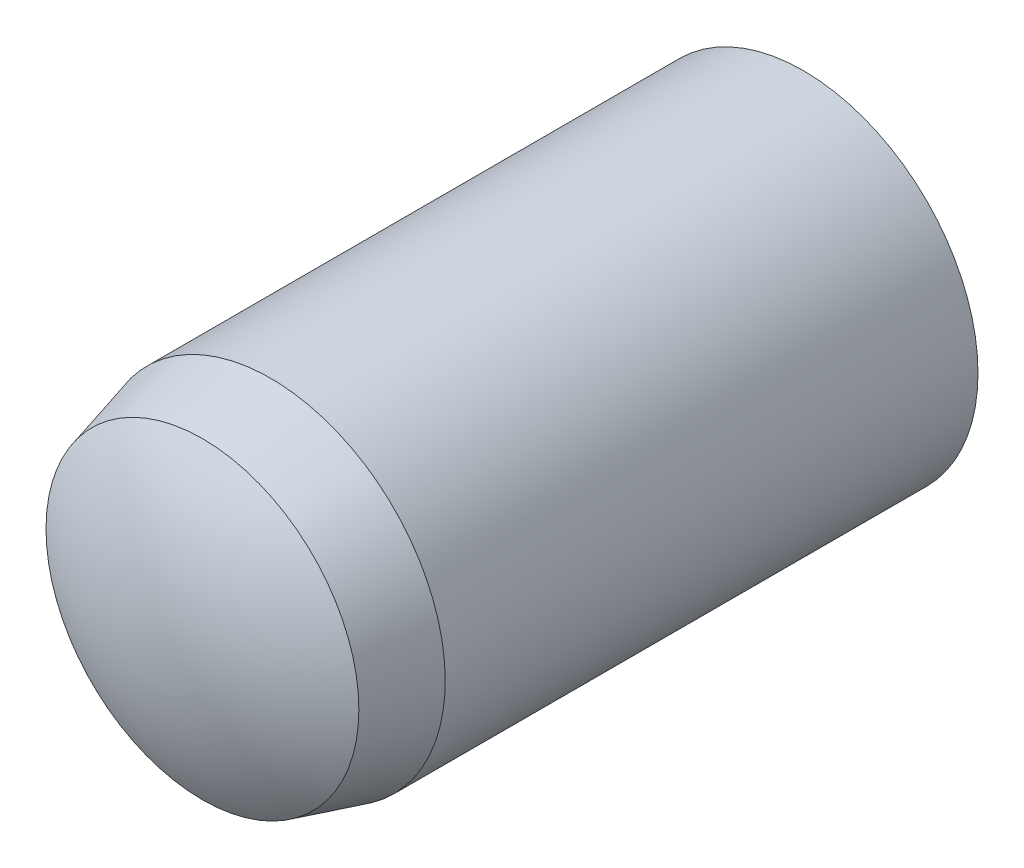
ISO-10303-21;
HEADER;
FILE_DESCRIPTION(('STEP AP214'),'2;1');
FILE_NAME('part.step','',(''),(''),'','','');
FILE_SCHEMA(('AUTOMOTIVE_DESIGN { 1 0 10303 214 1 1 1 1 }'));
ENDSEC;
DATA;
#1=APPLICATION_CONTEXT('core data for automotive mechanical design processes');
#2=APPLICATION_PROTOCOL_DEFINITION('international standard','automotive_design',2000,#1);
#3=PRODUCT_CONTEXT('',#1,'mechanical');
#4=PRODUCT('Part','Part','',(#3));
#5=PRODUCT_RELATED_PRODUCT_CATEGORY('part','',(#4));
#6=PRODUCT_DEFINITION_FORMATION('','',#4);
#7=PRODUCT_DEFINITION_CONTEXT('part definition',#1,'design');
#8=PRODUCT_DEFINITION('design','',#6,#7);
#9=PRODUCT_DEFINITION_SHAPE('','',#8);
#10=(LENGTH_UNIT() NAMED_UNIT(*) SI_UNIT(.MILLI.,.METRE.));
#11=(NAMED_UNIT(*) PLANE_ANGLE_UNIT() SI_UNIT($,.RADIAN.));
#12=(NAMED_UNIT(*) SI_UNIT($,.STERADIAN.) SOLID_ANGLE_UNIT());
#13=UNCERTAINTY_MEASURE_WITH_UNIT(LENGTH_MEASURE(1.E-05),#10,'distance_accuracy_value','');
#14=(GEOMETRIC_REPRESENTATION_CONTEXT(3) GLOBAL_UNCERTAINTY_ASSIGNED_CONTEXT((#13)) GLOBAL_UNIT_ASSIGNED_CONTEXT((#10,
#11,#12)) REPRESENTATION_CONTEXT('',''));
#15=CARTESIAN_POINT('',(0.,0.,0.));
#16=DIRECTION('',(0.,0.,1.));
#17=DIRECTION('',(1.,0.,0.));
#18=AXIS2_PLACEMENT_3D('',#15,#16,#17);
#19=CARTESIAN_POINT('',(0.,0.,-0.733333333333334));
#20=DIRECTION('',(0.,0.,1.));
#21=DIRECTION('',(0.,1.,0.));
#22=AXIS2_PLACEMENT_3D('',#19,#20,#21);
#23=SPHERICAL_SURFACE('',#22,7.26666666666667);
#24=CARTESIAN_POINT('',(0.,0.,-6.8));
#25=DIRECTION('',(0.,0.,1.));
#26=DIRECTION('',(0.,-1.,0.));
#27=AXIS2_PLACEMENT_3D('',#24,#25,#26);
#28=CIRCLE('',#27,4.);
#29=CARTESIAN_POINT('',(0.,-4.,-6.8));
#30=VERTEX_POINT('',#29);
#31=EDGE_CURVE('E10',#30,#30,#28,.T.);
#32=ORIENTED_EDGE('',*,*,#31,.F.);
#33=EDGE_LOOP('',(#32));
#34=FACE_BOUND('',#33,.T.);
#35=ADVANCED_FACE('F39',(#34),#23,.T.);
#36=CARTESIAN_POINT('',(0.,0.,8.));
#37=DIRECTION('',(0.,0.,1.));
#38=DIRECTION('',(0.,-1.,0.));
#39=AXIS2_PLACEMENT_3D('',#36,#37,#38);
#40=CYLINDRICAL_SURFACE('',#39,4.);
#41=CARTESIAN_POINT('',(0.,0.,5.4));
#42=DIRECTION('',(0.,0.,1.));
#43=DIRECTION('',(0.,-1.,0.));
#44=AXIS2_PLACEMENT_3D('',#41,#42,#43);
#45=CIRCLE('',#44,4.);
#46=CARTESIAN_POINT('',(0.,-4.,5.4));
#47=VERTEX_POINT('',#46);
#48=EDGE_CURVE('E46',#47,#47,#45,.T.);
#49=ORIENTED_EDGE('',*,*,#48,.F.);
#50=EDGE_LOOP('',(#49));
#51=FACE_BOUND('',#50,.T.);
#52=ORIENTED_EDGE('',*,*,#31,.T.);
#53=EDGE_LOOP('',(#52));
#54=FACE_BOUND('',#53,.T.);
#55=ADVANCED_FACE('F66',(#51,#54),#40,.T.);
#56=CARTESIAN_POINT('',(0.,0.,5.4));
#57=DIRECTION('',(0.,0.,-1.));
#58=DIRECTION('',(0.,1.,0.));
#59=AXIS2_PLACEMENT_3D('',#56,#57,#58);
#60=CONICAL_SURFACE('',#59,4.,0.26179938779915);
#61=CARTESIAN_POINT('',(0.,0.,6.96));
#62=DIRECTION('',(0.,0.,1.));
#63=DIRECTION('',(0.,-1.,0.));
#64=AXIS2_PLACEMENT_3D('',#61,#62,#63);
#65=CIRCLE('',#64,3.58199925980745);
#66=CARTESIAN_POINT('',(0.,-3.58199925980745,6.96));
#67=VERTEX_POINT('',#66);
#68=EDGE_CURVE('E52',#67,#67,#65,.T.);
#69=ORIENTED_EDGE('',*,*,#68,.F.);
#70=EDGE_LOOP('',(#69));
#71=FACE_BOUND('',#70,.T.);
#72=ORIENTED_EDGE('',*,*,#48,.T.);
#73=EDGE_LOOP('',(#72));
#74=FACE_BOUND('',#73,.T.);
#75=ADVANCED_FACE('F64',(#71,#74),#60,.T.);
#76=CARTESIAN_POINT('',(0.,0.,1.31138524170139));
#77=DIRECTION('',(0.,0.,1.));
#78=DIRECTION('',(0.,1.,0.));
#79=AXIS2_PLACEMENT_3D('',#76,#77,#78);
#80=SPHERICAL_SURFACE('',#79,6.68861475829861);
#81=ORIENTED_EDGE('',*,*,#68,.T.);
#82=EDGE_LOOP('',(#81));
#83=FACE_BOUND('',#82,.T.);
#84=ADVANCED_FACE('F62',(#83),#80,.T.);
#85=CLOSED_SHELL('',(#35,#55,#75,#84));
#86=MANIFOLD_SOLID_BREP('B2',#85);
#87=ADVANCED_BREP_SHAPE_REPRESENTATION('',(#18,#86),#14);
#88=SHAPE_DEFINITION_REPRESENTATION(#9,#87);
ENDSEC;
END-ISO-10303-21;
